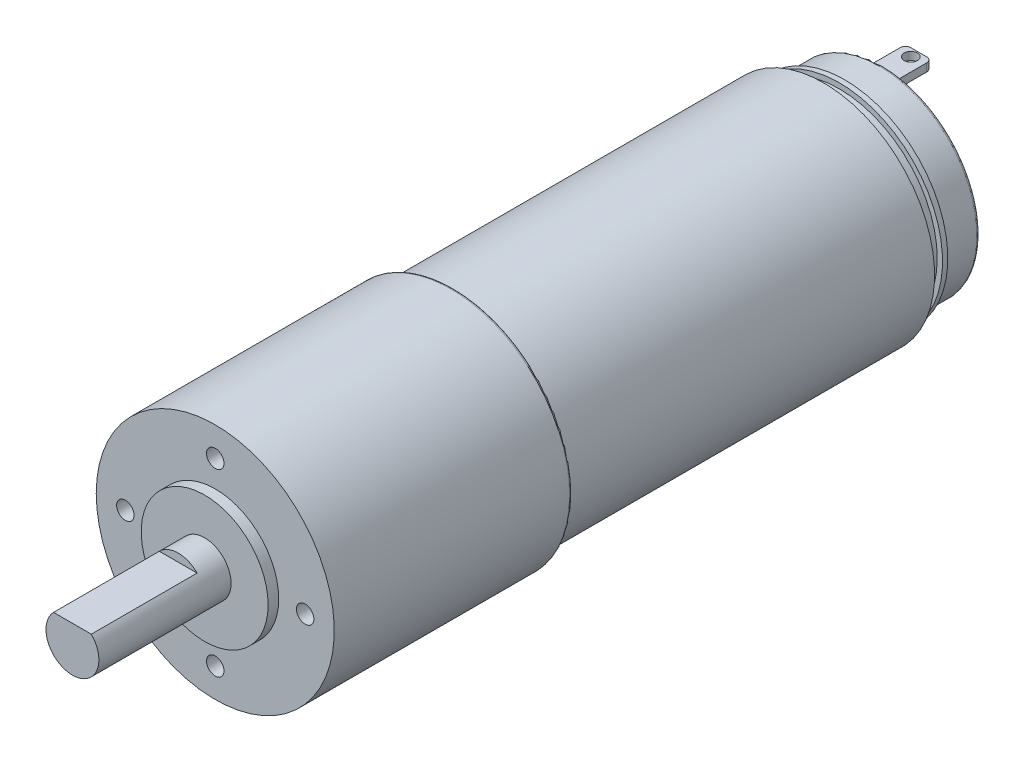
ISO-10303-21;
HEADER;
FILE_DESCRIPTION(('STEP AP214'),'2;1');
FILE_NAME('part.step','',(''),(''),'','','');
FILE_SCHEMA(('AUTOMOTIVE_DESIGN { 1 0 10303 214 1 1 1 1 }'));
ENDSEC;
DATA;
#1=APPLICATION_CONTEXT('core data for automotive mechanical design processes');
#2=APPLICATION_PROTOCOL_DEFINITION('international standard','automotive_design',2000,#1);
#3=PRODUCT_CONTEXT('',#1,'mechanical');
#4=PRODUCT('Part','Part','',(#3));
#5=PRODUCT_RELATED_PRODUCT_CATEGORY('part','',(#4));
#6=PRODUCT_DEFINITION_FORMATION('','',#4);
#7=PRODUCT_DEFINITION_CONTEXT('part definition',#1,'design');
#8=PRODUCT_DEFINITION('design','',#6,#7);
#9=PRODUCT_DEFINITION_SHAPE('','',#8);
#10=(LENGTH_UNIT() NAMED_UNIT(*) SI_UNIT(.MILLI.,.METRE.));
#11=(NAMED_UNIT(*) PLANE_ANGLE_UNIT() SI_UNIT($,.RADIAN.));
#12=(NAMED_UNIT(*) SI_UNIT($,.STERADIAN.) SOLID_ANGLE_UNIT());
#13=UNCERTAINTY_MEASURE_WITH_UNIT(LENGTH_MEASURE(1.E-05),#10,'distance_accuracy_value','');
#14=(GEOMETRIC_REPRESENTATION_CONTEXT(3) GLOBAL_UNCERTAINTY_ASSIGNED_CONTEXT((#13)) GLOBAL_UNIT_ASSIGNED_CONTEXT((#10,
#11,#12)) REPRESENTATION_CONTEXT('',''));
#15=CARTESIAN_POINT('',(0.,0.,0.));
#16=DIRECTION('',(0.,0.,1.));
#17=DIRECTION('',(1.,0.,0.));
#18=AXIS2_PLACEMENT_3D('',#15,#16,#17);
#19=CARTESIAN_POINT('',(0.,0.,-81.));
#20=DIRECTION('',(0.,0.,-1.));
#21=DIRECTION('',(-1.,0.,0.));
#22=AXIS2_PLACEMENT_3D('',#19,#20,#21);
#23=PLANE('',#22);
#24=CARTESIAN_POINT('',(0.,0.,-81.));
#25=DIRECTION('',(0.,0.,-1.));
#26=DIRECTION('',(-1.,0.,0.));
#27=AXIS2_PLACEMENT_3D('',#24,#25,#26);
#28=CIRCLE('',#27,18.);
#29=CARTESIAN_POINT('',(-18.,0.,-81.));
#30=VERTEX_POINT('',#29);
#31=EDGE_CURVE('E328',#30,#30,#28,.T.);
#32=ORIENTED_EDGE('',*,*,#31,.T.);
#33=EDGE_LOOP('',(#32));
#34=FACE_BOUND('',#33,.T.);
#35=DIRECTION('',(-1.,0.,0.));
#36=VECTOR('',#35,1.);
#37=CARTESIAN_POINT('',(2.5,15.5,-81.));
#38=LINE('',#37,#36);
#39=CARTESIAN_POINT('',(2.5,15.5,-81.));
#40=VERTEX_POINT('',#39);
#41=CARTESIAN_POINT('',(-2.5,15.5,-81.));
#42=VERTEX_POINT('',#41);
#43=EDGE_CURVE('E203',#40,#42,#38,.T.);
#44=ORIENTED_EDGE('',*,*,#43,.F.);
#45=DIRECTION('',(0.,-1.,0.));
#46=VECTOR('',#45,1.);
#47=CARTESIAN_POINT('',(2.5,17.,-81.));
#48=LINE('',#47,#46);
#49=CARTESIAN_POINT('',(2.5,17.,-81.));
#50=VERTEX_POINT('',#49);
#51=EDGE_CURVE('E166',#50,#40,#48,.T.);
#52=ORIENTED_EDGE('',*,*,#51,.F.);
#53=DIRECTION('',(1.,0.,0.));
#54=VECTOR('',#53,1.);
#55=CARTESIAN_POINT('',(2.5,17.,-81.));
#56=LINE('',#55,#54);
#57=CARTESIAN_POINT('',(-2.5,17.,-81.));
#58=VERTEX_POINT('',#57);
#59=EDGE_CURVE('E197',#58,#50,#56,.T.);
#60=ORIENTED_EDGE('',*,*,#59,.F.);
#61=DIRECTION('',(0.,1.,0.));
#62=VECTOR('',#61,1.);
#63=CARTESIAN_POINT('',(-2.5,17.,-81.));
#64=LINE('',#63,#62);
#65=EDGE_CURVE('E206',#42,#58,#64,.T.);
#66=ORIENTED_EDGE('',*,*,#65,.F.);
#67=EDGE_LOOP('',(#44,#52,#60,#66));
#68=FACE_BOUND('',#67,.T.);
#69=DIRECTION('',(0.,1.,0.));
#70=VECTOR('',#69,1.);
#71=CARTESIAN_POINT('',(-2.49999999999999,-16.9999999999999,-81.));
#72=LINE('',#71,#70);
#73=CARTESIAN_POINT('',(-2.49999999999999,-16.9999999999999,-81.));
#74=VERTEX_POINT('',#73);
#75=CARTESIAN_POINT('',(-2.5,-15.5,-81.));
#76=VERTEX_POINT('',#75);
#77=EDGE_CURVE('E160',#74,#76,#72,.T.);
#78=ORIENTED_EDGE('',*,*,#77,.F.);
#79=DIRECTION('',(-1.,0.,0.));
#80=VECTOR('',#79,1.);
#81=CARTESIAN_POINT('',(-2.49999999999999,-16.9999999999999,-81.));
#82=LINE('',#81,#80);
#83=CARTESIAN_POINT('',(2.50000000000001,-16.9999999999999,-81.));
#84=VERTEX_POINT('',#83);
#85=EDGE_CURVE('E170',#84,#74,#82,.T.);
#86=ORIENTED_EDGE('',*,*,#85,.F.);
#87=DIRECTION('',(0.,-1.,0.));
#88=VECTOR('',#87,1.);
#89=CARTESIAN_POINT('',(2.50000000000001,-16.9999999999999,-81.));
#90=LINE('',#89,#88);
#91=CARTESIAN_POINT('',(2.50000000000001,-15.5,-81.));
#92=VERTEX_POINT('',#91);
#93=EDGE_CURVE('E182',#92,#84,#90,.T.);
#94=ORIENTED_EDGE('',*,*,#93,.F.);
#95=DIRECTION('',(1.,0.,0.));
#96=VECTOR('',#95,1.);
#97=CARTESIAN_POINT('',(-2.5,-15.5,-81.));
#98=LINE('',#97,#96);
#99=EDGE_CURVE('E180',#76,#92,#98,.T.);
#100=ORIENTED_EDGE('',*,*,#99,.F.);
#101=EDGE_LOOP('',(#78,#86,#94,#100));
#102=FACE_BOUND('',#101,.T.);
#103=ADVANCED_FACE('F42',(#34,#68,#102),#23,.T.);
#104=CARTESIAN_POINT('',(0.,0.,45.));
#105=DIRECTION('',(0.,0.,-1.));
#106=DIRECTION('',(-1.,0.,0.));
#107=AXIS2_PLACEMENT_3D('',#104,#105,#106);
#108=CYLINDRICAL_SURFACE('',#107,22.5);
#109=CARTESIAN_POINT('',(0.,0.,0.5));
#110=DIRECTION('',(0.,0.,1.));
#111=DIRECTION('',(1.,0.,0.));
#112=AXIS2_PLACEMENT_3D('',#109,#110,#111);
#113=CIRCLE('',#112,22.5);
#114=CARTESIAN_POINT('',(-22.5,0.,0.499999999999994));
#115=VERTEX_POINT('',#114);
#116=EDGE_CURVE('E50',#115,#115,#113,.T.);
#117=CARTESIAN_POINT('',(0.,0.,45.));
#118=DIRECTION('',(0.,0.,1.));
#119=DIRECTION('',(1.,0.,0.));
#120=AXIS2_PLACEMENT_3D('',#117,#118,#119);
#121=CIRCLE('',#120,22.5);
#122=CARTESIAN_POINT('',(-22.5,0.,45.));
#123=VERTEX_POINT('',#122);
#124=EDGE_CURVE('E259',#123,#123,#121,.T.);
#125=CARTESIAN_POINT('',(-22.5,0.,0.499999999999994));
#126=CARTESIAN_POINT('',(-22.5,0.,0.963541666666661));
#127=CARTESIAN_POINT('',(-22.5,0.,1.42708333333333));
#128=CARTESIAN_POINT('',(-22.5,0.,2.35416666666666));
#129=CARTESIAN_POINT('',(-22.5,0.,2.81770833333333));
#130=CARTESIAN_POINT('',(-22.5,0.,3.74479166666666));
#131=CARTESIAN_POINT('',(-22.5,0.,4.20833333333333));
#132=CARTESIAN_POINT('',(-22.5,0.,5.13541666666666));
#133=CARTESIAN_POINT('',(-22.5,0.,5.59895833333333));
#134=CARTESIAN_POINT('',(-22.5,0.,6.52604166666666));
#135=CARTESIAN_POINT('',(-22.5,0.,6.98958333333333));
#136=CARTESIAN_POINT('',(-22.5,0.,7.91666666666666));
#137=CARTESIAN_POINT('',(-22.5,0.,8.38020833333333));
#138=CARTESIAN_POINT('',(-22.5,0.,9.30729166666666));
#139=CARTESIAN_POINT('',(-22.5,0.,9.77083333333333));
#140=CARTESIAN_POINT('',(-22.5,0.,10.6979166666667));
#141=CARTESIAN_POINT('',(-22.5,0.,11.1614583333333));
#142=CARTESIAN_POINT('',(-22.5,0.,12.0885416666667));
#143=CARTESIAN_POINT('',(-22.5,0.,12.5520833333333));
#144=CARTESIAN_POINT('',(-22.5,0.,13.4791666666667));
#145=CARTESIAN_POINT('',(-22.5,0.,13.9427083333333));
#146=CARTESIAN_POINT('',(-22.5,0.,14.8697916666667));
#147=CARTESIAN_POINT('',(-22.5,0.,15.3333333333333));
#148=CARTESIAN_POINT('',(-22.5,0.,16.2604166666667));
#149=CARTESIAN_POINT('',(-22.5,0.,16.7239583333333));
#150=CARTESIAN_POINT('',(-22.5,0.,17.6510416666667));
#151=CARTESIAN_POINT('',(-22.5,0.,18.1145833333333));
#152=CARTESIAN_POINT('',(-22.5,0.,19.0416666666667));
#153=CARTESIAN_POINT('',(-22.5,0.,19.5052083333333));
#154=CARTESIAN_POINT('',(-22.5,0.,20.4322916666667));
#155=CARTESIAN_POINT('',(-22.5,0.,20.8958333333333));
#156=CARTESIAN_POINT('',(-22.5,0.,21.8229166666667));
#157=CARTESIAN_POINT('',(-22.5,0.,22.2864583333333));
#158=CARTESIAN_POINT('',(-22.5,0.,23.2135416666667));
#159=CARTESIAN_POINT('',(-22.5,0.,23.6770833333333));
#160=CARTESIAN_POINT('',(-22.5,0.,24.6041666666667));
#161=CARTESIAN_POINT('',(-22.5,0.,25.0677083333333));
#162=CARTESIAN_POINT('',(-22.5,0.,25.9947916666667));
#163=CARTESIAN_POINT('',(-22.5,0.,26.4583333333333));
#164=CARTESIAN_POINT('',(-22.5,0.,27.3854166666667));
#165=CARTESIAN_POINT('',(-22.5,0.,27.8489583333333));
#166=CARTESIAN_POINT('',(-22.5,0.,28.7760416666667));
#167=CARTESIAN_POINT('',(-22.5,0.,29.2395833333333));
#168=CARTESIAN_POINT('',(-22.5,0.,30.1666666666667));
#169=CARTESIAN_POINT('',(-22.5,0.,30.6302083333333));
#170=CARTESIAN_POINT('',(-22.5,0.,31.5572916666667));
#171=CARTESIAN_POINT('',(-22.5,0.,32.0208333333333));
#172=CARTESIAN_POINT('',(-22.5,0.,32.9479166666667));
#173=CARTESIAN_POINT('',(-22.5,0.,33.4114583333333));
#174=CARTESIAN_POINT('',(-22.5,0.,34.3385416666667));
#175=CARTESIAN_POINT('',(-22.5,0.,34.8020833333333));
#176=CARTESIAN_POINT('',(-22.5,0.,35.7291666666667));
#177=CARTESIAN_POINT('',(-22.5,0.,36.1927083333333));
#178=CARTESIAN_POINT('',(-22.5,0.,37.1197916666667));
#179=CARTESIAN_POINT('',(-22.5,0.,37.5833333333333));
#180=CARTESIAN_POINT('',(-22.5,0.,38.5104166666667));
#181=CARTESIAN_POINT('',(-22.5,0.,38.9739583333333));
#182=CARTESIAN_POINT('',(-22.5,0.,39.9010416666667));
#183=CARTESIAN_POINT('',(-22.5,0.,40.3645833333333));
#184=CARTESIAN_POINT('',(-22.5,0.,41.2916666666667));
#185=CARTESIAN_POINT('',(-22.5,0.,41.7552083333333));
#186=CARTESIAN_POINT('',(-22.5,0.,42.6822916666667));
#187=CARTESIAN_POINT('',(-22.5,0.,43.1458333333333));
#188=CARTESIAN_POINT('',(-22.5,0.,44.0729166666667));
#189=CARTESIAN_POINT('',(-22.5,0.,44.5364583333333));
#190=CARTESIAN_POINT('',(-22.5,0.,45.));
#191=B_SPLINE_CURVE_WITH_KNOTS('',3,(#125,#126,#127,#128,#129,#130,#131,#132,#133,#134,#135,
#136,#137,#138,#139,#140,#141,#142,#143,#144,#145,#146,#147,#148,#149,#150,#151,#152,#153,#154,
#155,#156,#157,#158,#159,#160,#161,#162,#163,#164,#165,#166,#167,#168,#169,#170,#171,#172,#173,
#174,#175,#176,#177,#178,#179,#180,#181,#182,#183,#184,#185,#186,#187,#188,#189,#190),
.UNSPECIFIED.,.F.,.F.,(4,2,2,2,2,2,2,2,2,2,2,2,2,2,2,2,2,2,2,2,2,2,2,2,2,2,2,2,2,2,2,2,4),(0.,
1.390625,2.78125,4.171875,5.5625,6.953125,8.34375,9.734375,11.125,12.515625,13.90625,15.296875,
16.6875,18.078125,19.46875,20.859375,22.25,23.640625,25.03125,26.421875,27.8125,29.203125,
30.59375,31.984375,33.375,34.765625,36.15625,37.546875,38.9375,40.328125,41.71875,43.109375,
44.5),.UNSPECIFIED.);
#192=EDGE_CURVE('BSEAM336',#115,#123,#191,.T.);
#193=ORIENTED_EDGE('',*,*,#116,.T.);
#194=ORIENTED_EDGE('',*,*,#124,.F.);
#195=ORIENTED_EDGE('',*,*,#192,.T.);
#196=ORIENTED_EDGE('',*,*,#192,.F.);
#197=EDGE_LOOP('',(#193,#195,#194,#196));
#198=FACE_BOUND('',#197,.T.);
#199=ADVANCED_FACE('F336',(#198),#108,.T.);
#200=CARTESIAN_POINT('',(0.,0.,45.));
#201=DIRECTION('',(0.,0.,1.));
#202=DIRECTION('',(1.,0.,0.));
#203=AXIS2_PLACEMENT_3D('',#200,#201,#202);
#204=PLANE('',#203);
#205=CARTESIAN_POINT('',(0.,0.,45.));
#206=DIRECTION('',(0.,0.,1.));
#207=DIRECTION('',(1.,0.,0.));
#208=AXIS2_PLACEMENT_3D('',#205,#206,#207);
#209=CIRCLE('',#208,12.);
#210=CARTESIAN_POINT('',(12.,0.,45.));
#211=VERTEX_POINT('',#210);
#212=EDGE_CURVE('E256',#211,#211,#209,.T.);
#213=ORIENTED_EDGE('',*,*,#212,.F.);
#214=EDGE_LOOP('',(#213));
#215=FACE_BOUND('',#214,.T.);
#216=CARTESIAN_POINT('',(0.,17.,45.));
#217=DIRECTION('',(0.,0.,1.));
#218=DIRECTION('',(1.,0.,0.));
#219=AXIS2_PLACEMENT_3D('',#216,#217,#218);
#220=CIRCLE('',#219,1.64999999999999);
#221=CARTESIAN_POINT('',(1.64999999999999,17.,45.));
#222=VERTEX_POINT('',#221);
#223=EDGE_CURVE('E263',#222,#222,#220,.T.);
#224=ORIENTED_EDGE('',*,*,#223,.F.);
#225=EDGE_LOOP('',(#224));
#226=FACE_BOUND('',#225,.T.);
#227=CARTESIAN_POINT('',(17.,0.,45.));
#228=DIRECTION('',(0.,0.,1.));
#229=DIRECTION('',(1.,0.,0.));
#230=AXIS2_PLACEMENT_3D('',#227,#228,#229);
#231=CIRCLE('',#230,1.64999999999999);
#232=CARTESIAN_POINT('',(18.65,0.,45.));
#233=VERTEX_POINT('',#232);
#234=EDGE_CURVE('E271',#233,#233,#231,.T.);
#235=ORIENTED_EDGE('',*,*,#234,.F.);
#236=EDGE_LOOP('',(#235));
#237=FACE_BOUND('',#236,.T.);
#238=CARTESIAN_POINT('',(0.,-17.,45.));
#239=DIRECTION('',(0.,0.,1.));
#240=DIRECTION('',(1.,0.,0.));
#241=AXIS2_PLACEMENT_3D('',#238,#239,#240);
#242=CIRCLE('',#241,1.64999999999999);
#243=CARTESIAN_POINT('',(1.64999999999999,-17.,45.));
#244=VERTEX_POINT('',#243);
#245=EDGE_CURVE('E277',#244,#244,#242,.T.);
#246=ORIENTED_EDGE('',*,*,#245,.F.);
#247=EDGE_LOOP('',(#246));
#248=FACE_BOUND('',#247,.T.);
#249=CARTESIAN_POINT('',(-17.,0.,45.));
#250=DIRECTION('',(0.,0.,1.));
#251=DIRECTION('',(1.,0.,0.));
#252=AXIS2_PLACEMENT_3D('',#249,#250,#251);
#253=CIRCLE('',#252,1.64999999999999);
#254=CARTESIAN_POINT('',(-15.35,0.,45.));
#255=VERTEX_POINT('',#254);
#256=EDGE_CURVE('E283',#255,#255,#253,.T.);
#257=ORIENTED_EDGE('',*,*,#256,.F.);
#258=EDGE_LOOP('',(#257));
#259=FACE_BOUND('',#258,.T.);
#260=ORIENTED_EDGE('',*,*,#124,.T.);
#261=EDGE_LOOP('',(#260));
#262=FACE_BOUND('',#261,.T.);
#263=ADVANCED_FACE('F354',(#215,#226,#237,#248,#259,#262),#204,.T.);
#264=CARTESIAN_POINT('',(0.,0.,0.));
#265=DIRECTION('',(0.,0.,1.));
#266=DIRECTION('',(1.,0.,0.));
#267=AXIS2_PLACEMENT_3D('',#264,#265,#266);
#268=PLANE('',#267);
#269=CARTESIAN_POINT('',(0.,0.,0.));
#270=DIRECTION('',(0.,0.,1.));
#271=DIRECTION('',(1.,0.,0.));
#272=AXIS2_PLACEMENT_3D('',#269,#270,#271);
#273=CIRCLE('',#272,22.);
#274=CARTESIAN_POINT('',(22.,0.,0.));
#275=VERTEX_POINT('',#274);
#276=EDGE_CURVE('E11',#275,#275,#273,.F.);
#277=ORIENTED_EDGE('',*,*,#276,.T.);
#278=EDGE_LOOP('',(#277));
#279=FACE_BOUND('',#278,.T.);
#280=CARTESIAN_POINT('',(0.,0.,0.));
#281=DIRECTION('',(0.,0.,-1.));
#282=DIRECTION('',(-1.,0.,0.));
#283=AXIS2_PLACEMENT_3D('',#280,#281,#282);
#284=CIRCLE('',#283,21.);
#285=CARTESIAN_POINT('',(-21.,0.,0.));
#286=VERTEX_POINT('',#285);
#287=EDGE_CURVE('E235',#286,#286,#284,.T.);
#288=ORIENTED_EDGE('',*,*,#287,.F.);
#289=EDGE_LOOP('',(#288));
#290=FACE_BOUND('',#289,.T.);
#291=ADVANCED_FACE('F444',(#279,#290),#268,.F.);
#292=CARTESIAN_POINT('',(-17.,0.,34.9));
#293=DIRECTION('',(0.,0.,1.));
#294=DIRECTION('',(1.,0.,0.));
#295=AXIS2_PLACEMENT_3D('',#292,#293,#294);
#296=CONICAL_SURFACE('',#295,1.64999999999999,1.02974425867665);
#297=CARTESIAN_POINT('',(-17.,0.,33.9085799786045));
#298=VERTEX_POINT('',#297);
#299=VERTEX_LOOP('',#298);
#300=FACE_BOUND('',#299,.T.);
#301=CARTESIAN_POINT('',(-17.,0.,34.9));
#302=DIRECTION('',(0.,0.,1.));
#303=DIRECTION('',(1.,0.,0.));
#304=AXIS2_PLACEMENT_3D('',#301,#302,#303);
#305=CIRCLE('',#304,1.64999999999999);
#306=CARTESIAN_POINT('',(-15.35,0.,34.9));
#307=VERTEX_POINT('',#306);
#308=EDGE_CURVE('E286',#307,#307,#305,.T.);
#309=ORIENTED_EDGE('',*,*,#308,.T.);
#310=EDGE_LOOP('',(#309));
#311=FACE_BOUND('',#310,.T.);
#312=ADVANCED_FACE('F440',(#300,#311),#296,.F.);
#313=CARTESIAN_POINT('',(-17.,0.,45.));
#314=DIRECTION('',(0.,0.,1.));
#315=DIRECTION('',(1.,0.,0.));
#316=AXIS2_PLACEMENT_3D('',#313,#314,#315);
#317=CYLINDRICAL_SURFACE('',#316,1.64999999999999);
#318=ORIENTED_EDGE('',*,*,#308,.F.);
#319=EDGE_LOOP('',(#318));
#320=FACE_BOUND('',#319,.T.);
#321=ORIENTED_EDGE('',*,*,#256,.T.);
#322=EDGE_LOOP('',(#321));
#323=FACE_BOUND('',#322,.T.);
#324=ADVANCED_FACE('F436',(#320,#323),#317,.F.);
#325=CARTESIAN_POINT('',(0.,-17.,34.9));
#326=DIRECTION('',(0.,0.,1.));
#327=DIRECTION('',(1.,0.,0.));
#328=AXIS2_PLACEMENT_3D('',#325,#326,#327);
#329=CONICAL_SURFACE('',#328,1.64999999999999,1.02974425867665);
#330=CARTESIAN_POINT('',(0.,-17.,33.9085799786045));
#331=VERTEX_POINT('',#330);
#332=VERTEX_LOOP('',#331);
#333=FACE_BOUND('',#332,.T.);
#334=CARTESIAN_POINT('',(0.,-17.,34.9));
#335=DIRECTION('',(0.,0.,1.));
#336=DIRECTION('',(1.,0.,0.));
#337=AXIS2_PLACEMENT_3D('',#334,#335,#336);
#338=CIRCLE('',#337,1.64999999999999);
#339=CARTESIAN_POINT('',(1.64999999999999,-17.,34.9));
#340=VERTEX_POINT('',#339);
#341=EDGE_CURVE('E280',#340,#340,#338,.T.);
#342=ORIENTED_EDGE('',*,*,#341,.T.);
#343=EDGE_LOOP('',(#342));
#344=FACE_BOUND('',#343,.T.);
#345=ADVANCED_FACE('F432',(#333,#344),#329,.F.);
#346=CARTESIAN_POINT('',(0.,-17.,45.));
#347=DIRECTION('',(0.,0.,1.));
#348=DIRECTION('',(1.,0.,0.));
#349=AXIS2_PLACEMENT_3D('',#346,#347,#348);
#350=CYLINDRICAL_SURFACE('',#349,1.64999999999999);
#351=ORIENTED_EDGE('',*,*,#341,.F.);
#352=EDGE_LOOP('',(#351));
#353=FACE_BOUND('',#352,.T.);
#354=ORIENTED_EDGE('',*,*,#245,.T.);
#355=EDGE_LOOP('',(#354));
#356=FACE_BOUND('',#355,.T.);
#357=ADVANCED_FACE('F428',(#353,#356),#350,.F.);
#358=CARTESIAN_POINT('',(17.,0.,34.9));
#359=DIRECTION('',(0.,0.,1.));
#360=DIRECTION('',(1.,0.,0.));
#361=AXIS2_PLACEMENT_3D('',#358,#359,#360);
#362=CONICAL_SURFACE('',#361,1.64999999999999,1.02974425867665);
#363=CARTESIAN_POINT('',(17.,0.,33.9085799786045));
#364=VERTEX_POINT('',#363);
#365=VERTEX_LOOP('',#364);
#366=FACE_BOUND('',#365,.T.);
#367=CARTESIAN_POINT('',(17.,0.,34.9));
#368=DIRECTION('',(0.,0.,1.));
#369=DIRECTION('',(1.,0.,0.));
#370=AXIS2_PLACEMENT_3D('',#367,#368,#369);
#371=CIRCLE('',#370,1.64999999999999);
#372=CARTESIAN_POINT('',(18.65,0.,34.9));
#373=VERTEX_POINT('',#372);
#374=EDGE_CURVE('E274',#373,#373,#371,.T.);
#375=ORIENTED_EDGE('',*,*,#374,.T.);
#376=EDGE_LOOP('',(#375));
#377=FACE_BOUND('',#376,.T.);
#378=ADVANCED_FACE('F424',(#366,#377),#362,.F.);
#379=CARTESIAN_POINT('',(17.,0.,45.));
#380=DIRECTION('',(0.,0.,1.));
#381=DIRECTION('',(1.,0.,0.));
#382=AXIS2_PLACEMENT_3D('',#379,#380,#381);
#383=CYLINDRICAL_SURFACE('',#382,1.64999999999999);
#384=ORIENTED_EDGE('',*,*,#374,.F.);
#385=EDGE_LOOP('',(#384));
#386=FACE_BOUND('',#385,.T.);
#387=ORIENTED_EDGE('',*,*,#234,.T.);
#388=EDGE_LOOP('',(#387));
#389=FACE_BOUND('',#388,.T.);
#390=ADVANCED_FACE('F420',(#386,#389),#383,.F.);
#391=CARTESIAN_POINT('',(0.,17.,34.9));
#392=DIRECTION('',(0.,0.,1.));
#393=DIRECTION('',(1.,0.,0.));
#394=AXIS2_PLACEMENT_3D('',#391,#392,#393);
#395=CONICAL_SURFACE('',#394,1.64999999999999,1.02974425867665);
#396=CARTESIAN_POINT('',(0.,17.,33.9085799786045));
#397=VERTEX_POINT('',#396);
#398=VERTEX_LOOP('',#397);
#399=FACE_BOUND('',#398,.T.);
#400=CARTESIAN_POINT('',(0.,17.,34.9));
#401=DIRECTION('',(0.,0.,1.));
#402=DIRECTION('',(1.,0.,0.));
#403=AXIS2_PLACEMENT_3D('',#400,#401,#402);
#404=CIRCLE('',#403,1.64999999999999);
#405=CARTESIAN_POINT('',(1.64999999999999,17.,34.9));
#406=VERTEX_POINT('',#405);
#407=EDGE_CURVE('E268',#406,#406,#404,.T.);
#408=ORIENTED_EDGE('',*,*,#407,.T.);
#409=EDGE_LOOP('',(#408));
#410=FACE_BOUND('',#409,.T.);
#411=ADVANCED_FACE('F416',(#399,#410),#395,.F.);
#412=CARTESIAN_POINT('',(0.,17.,45.));
#413=DIRECTION('',(0.,0.,1.));
#414=DIRECTION('',(1.,0.,0.));
#415=AXIS2_PLACEMENT_3D('',#412,#413,#414);
#416=CYLINDRICAL_SURFACE('',#415,1.64999999999999);
#417=ORIENTED_EDGE('',*,*,#407,.F.);
#418=EDGE_LOOP('',(#417));
#419=FACE_BOUND('',#418,.T.);
#420=ORIENTED_EDGE('',*,*,#223,.T.);
#421=EDGE_LOOP('',(#420));
#422=FACE_BOUND('',#421,.T.);
#423=ADVANCED_FACE('F412',(#419,#422),#416,.F.);
#424=CARTESIAN_POINT('',(0.,0.,47.));
#425=DIRECTION('',(0.,0.,-1.));
#426=DIRECTION('',(-1.,0.,0.));
#427=AXIS2_PLACEMENT_3D('',#424,#425,#426);
#428=CYLINDRICAL_SURFACE('',#427,12.);
#429=CARTESIAN_POINT('',(0.,0.,47.));
#430=DIRECTION('',(0.,0.,1.));
#431=DIRECTION('',(1.,0.,0.));
#432=AXIS2_PLACEMENT_3D('',#429,#430,#431);
#433=CIRCLE('',#432,12.);
#434=CARTESIAN_POINT('',(12.,0.,47.));
#435=VERTEX_POINT('',#434);
#436=EDGE_CURVE('E260',#435,#435,#433,.T.);
#437=ORIENTED_EDGE('',*,*,#436,.F.);
#438=EDGE_LOOP('',(#437));
#439=FACE_BOUND('',#438,.T.);
#440=ORIENTED_EDGE('',*,*,#212,.T.);
#441=EDGE_LOOP('',(#440));
#442=FACE_BOUND('',#441,.T.);
#443=ADVANCED_FACE('F408',(#439,#442),#428,.T.);
#444=CARTESIAN_POINT('',(0.,0.,47.));
#445=DIRECTION('',(0.,0.,1.));
#446=DIRECTION('',(1.,0.,0.));
#447=AXIS2_PLACEMENT_3D('',#444,#445,#446);
#448=PLANE('',#447);
#449=CARTESIAN_POINT('',(0.,0.,47.));
#450=DIRECTION('',(0.,0.,1.));
#451=DIRECTION('',(1.,0.,0.));
#452=AXIS2_PLACEMENT_3D('',#449,#450,#451);
#453=CIRCLE('',#452,5.);
#454=CARTESIAN_POINT('',(5.,0.,47.));
#455=VERTEX_POINT('',#454);
#456=EDGE_CURVE('E241',#455,#455,#453,.T.);
#457=ORIENTED_EDGE('',*,*,#456,.F.);
#458=EDGE_LOOP('',(#457));
#459=FACE_BOUND('',#458,.T.);
#460=ORIENTED_EDGE('',*,*,#436,.T.);
#461=EDGE_LOOP('',(#460));
#462=FACE_BOUND('',#461,.T.);
#463=ADVANCED_FACE('F404',(#459,#462),#448,.T.);
#464=CARTESIAN_POINT('',(0.,0.,72.));
#465=DIRECTION('',(0.,0.,-1.));
#466=DIRECTION('',(-1.,0.,0.));
#467=AXIS2_PLACEMENT_3D('',#464,#465,#466);
#468=CYLINDRICAL_SURFACE('',#467,5.);
#469=CARTESIAN_POINT('',(0.,0.,72.));
#470=DIRECTION('',(0.,0.,1.));
#471=DIRECTION('',(1.,0.,0.));
#472=AXIS2_PLACEMENT_3D('',#469,#470,#471);
#473=CIRCLE('',#472,5.);
#474=CARTESIAN_POINT('',(-3.57071421427142,3.5,72.));
#475=VERTEX_POINT('',#474);
#476=CARTESIAN_POINT('',(3.57071421427143,3.5,72.));
#477=VERTEX_POINT('',#476);
#478=EDGE_CURVE('E252',#475,#477,#473,.T.);
#479=ORIENTED_EDGE('',*,*,#478,.F.);
#480=DIRECTION('',(0.,0.,1.));
#481=VECTOR('',#480,1.);
#482=CARTESIAN_POINT('',(-3.57071421427143,3.5,52.));
#483=LINE('',#482,#481);
#484=CARTESIAN_POINT('',(-3.57071421427143,3.5,52.));
#485=VERTEX_POINT('',#484);
#486=EDGE_CURVE('E247',#485,#475,#483,.T.);
#487=ORIENTED_EDGE('',*,*,#486,.F.);
#488=CARTESIAN_POINT('',(0.,0.,52.));
#489=DIRECTION('',(0.,0.,1.));
#490=DIRECTION('',(1.,0.,0.));
#491=AXIS2_PLACEMENT_3D('',#488,#489,#490);
#492=CIRCLE('',#491,5.);
#493=CARTESIAN_POINT('',(3.57071421427143,3.5,52.));
#494=VERTEX_POINT('',#493);
#495=EDGE_CURVE('E242',#494,#485,#492,.T.);
#496=ORIENTED_EDGE('',*,*,#495,.F.);
#497=DIRECTION('',(0.,0.,1.));
#498=VECTOR('',#497,1.);
#499=CARTESIAN_POINT('',(3.57071421427143,3.5,52.));
#500=LINE('',#499,#498);
#501=EDGE_CURVE('E249',#494,#477,#500,.T.);
#502=ORIENTED_EDGE('',*,*,#501,.T.);
#503=EDGE_LOOP('',(#479,#487,#496,#502));
#504=FACE_BOUND('',#503,.T.);
#505=ORIENTED_EDGE('',*,*,#456,.T.);
#506=EDGE_LOOP('',(#505));
#507=FACE_BOUND('',#506,.T.);
#508=ADVANCED_FACE('F400',(#504,#507),#468,.T.);
#509=CARTESIAN_POINT('',(0.,0.,72.));
#510=DIRECTION('',(0.,0.,1.));
#511=DIRECTION('',(1.,0.,0.));
#512=AXIS2_PLACEMENT_3D('',#509,#510,#511);
#513=PLANE('',#512);
#514=DIRECTION('',(1.,0.,0.));
#515=VECTOR('',#514,1.);
#516=CARTESIAN_POINT('',(-3.57071421427143,3.5,72.));
#517=LINE('',#516,#515);
#518=EDGE_CURVE('E238',#475,#477,#517,.T.);
#519=ORIENTED_EDGE('',*,*,#518,.F.);
#520=ORIENTED_EDGE('',*,*,#478,.T.);
#521=EDGE_LOOP('',(#519,#520));
#522=FACE_BOUND('',#521,.T.);
#523=ADVANCED_FACE('F396',(#522),#513,.T.);
#524=CARTESIAN_POINT('',(-3.57071421427143,3.5,52.));
#525=DIRECTION('',(0.,-1.,0.));
#526=DIRECTION('',(0.,0.,-1.));
#527=AXIS2_PLACEMENT_3D('',#524,#525,#526);
#528=PLANE('',#527);
#529=ORIENTED_EDGE('',*,*,#518,.T.);
#530=ORIENTED_EDGE('',*,*,#501,.F.);
#531=DIRECTION('',(1.,0.,0.));
#532=VECTOR('',#531,1.);
#533=CARTESIAN_POINT('',(-3.57071421427143,3.5,52.));
#534=LINE('',#533,#532);
#535=EDGE_CURVE('E244',#485,#494,#534,.T.);
#536=ORIENTED_EDGE('',*,*,#535,.F.);
#537=ORIENTED_EDGE('',*,*,#486,.T.);
#538=EDGE_LOOP('',(#529,#530,#536,#537));
#539=FACE_BOUND('',#538,.T.);
#540=ADVANCED_FACE('F392',(#539),#528,.F.);
#541=CARTESIAN_POINT('',(0.,0.,52.));
#542=DIRECTION('',(0.,0.,1.));
#543=DIRECTION('',(1.,0.,0.));
#544=AXIS2_PLACEMENT_3D('',#541,#542,#543);
#545=PLANE('',#544);
#546=ORIENTED_EDGE('',*,*,#495,.T.);
#547=ORIENTED_EDGE('',*,*,#535,.T.);
#548=EDGE_LOOP('',(#546,#547));
#549=FACE_BOUND('',#548,.T.);
#550=ADVANCED_FACE('F388',(#549),#545,.T.);
#551=CARTESIAN_POINT('',(0.,0.,-70.));
#552=DIRECTION('',(0.,0.,1.));
#553=DIRECTION('',(1.,0.,0.));
#554=AXIS2_PLACEMENT_3D('',#551,#552,#553);
#555=CYLINDRICAL_SURFACE('',#554,21.);
#556=CARTESIAN_POINT('',(0.,0.,-70.));
#557=DIRECTION('',(0.,0.,-1.));
#558=DIRECTION('',(-1.,0.,0.));
#559=AXIS2_PLACEMENT_3D('',#556,#557,#558);
#560=CIRCLE('',#559,21.);
#561=CARTESIAN_POINT('',(-21.,0.,-70.));
#562=VERTEX_POINT('',#561);
#563=EDGE_CURVE('E232',#562,#562,#560,.T.);
#564=ORIENTED_EDGE('',*,*,#563,.F.);
#565=EDGE_LOOP('',(#564));
#566=FACE_BOUND('',#565,.T.);
#567=ORIENTED_EDGE('',*,*,#287,.T.);
#568=EDGE_LOOP('',(#567));
#569=FACE_BOUND('',#568,.T.);
#570=ADVANCED_FACE('F384',(#566,#569),#555,.T.);
#571=CARTESIAN_POINT('',(0.,0.,-70.));
#572=DIRECTION('',(0.,0.,-1.));
#573=DIRECTION('',(-1.,0.,0.));
#574=AXIS2_PLACEMENT_3D('',#571,#572,#573);
#575=PLANE('',#574);
#576=CARTESIAN_POINT('',(0.,0.,-70.));
#577=DIRECTION('',(0.,0.,-1.));
#578=DIRECTION('',(-1.,0.,0.));
#579=AXIS2_PLACEMENT_3D('',#576,#577,#578);
#580=CIRCLE('',#579,18.5);
#581=CARTESIAN_POINT('',(-18.5,0.,-70.));
#582=VERTEX_POINT('',#581);
#583=EDGE_CURVE('E223',#582,#582,#580,.T.);
#584=ORIENTED_EDGE('',*,*,#583,.F.);
#585=EDGE_LOOP('',(#584));
#586=FACE_BOUND('',#585,.T.);
#587=ORIENTED_EDGE('',*,*,#563,.T.);
#588=EDGE_LOOP('',(#587));
#589=FACE_BOUND('',#588,.T.);
#590=ADVANCED_FACE('F380',(#586,#589),#575,.T.);
#591=CARTESIAN_POINT('',(0.,0.,-73.));
#592=DIRECTION('',(0.,0.,1.));
#593=DIRECTION('',(1.,0.,0.));
#594=AXIS2_PLACEMENT_3D('',#591,#592,#593);
#595=CYLINDRICAL_SURFACE('',#594,18.5);
#596=CARTESIAN_POINT('',(0.,0.,-73.));
#597=DIRECTION('',(0.,0.,-1.));
#598=DIRECTION('',(-1.,0.,0.));
#599=AXIS2_PLACEMENT_3D('',#596,#597,#598);
#600=CIRCLE('',#599,18.5);
#601=CARTESIAN_POINT('',(-18.5,0.,-73.));
#602=VERTEX_POINT('',#601);
#603=EDGE_CURVE('E227',#602,#602,#600,.T.);
#604=ORIENTED_EDGE('',*,*,#603,.F.);
#605=EDGE_LOOP('',(#604));
#606=FACE_BOUND('',#605,.T.);
#607=ORIENTED_EDGE('',*,*,#583,.T.);
#608=EDGE_LOOP('',(#607));
#609=FACE_BOUND('',#608,.T.);
#610=ADVANCED_FACE('F376',(#606,#609),#595,.T.);
#611=CARTESIAN_POINT('',(0.,0.,-74.));
#612=DIRECTION('',(0.,0.,1.));
#613=DIRECTION('',(1.,0.,0.));
#614=AXIS2_PLACEMENT_3D('',#611,#612,#613);
#615=CYLINDRICAL_SURFACE('',#614,19.5);
#616=CARTESIAN_POINT('',(0.,0.,-74.));
#617=DIRECTION('',(0.,0.,-1.));
#618=DIRECTION('',(-1.,0.,0.));
#619=AXIS2_PLACEMENT_3D('',#616,#617,#618);
#620=CIRCLE('',#619,19.5);
#621=CARTESIAN_POINT('',(-19.5,0.,-74.));
#622=VERTEX_POINT('',#621);
#623=EDGE_CURVE('E224',#622,#622,#620,.T.);
#624=ORIENTED_EDGE('',*,*,#623,.F.);
#625=EDGE_LOOP('',(#624));
#626=FACE_BOUND('',#625,.T.);
#627=CARTESIAN_POINT('',(0.,0.,-73.));
#628=DIRECTION('',(0.,0.,-1.));
#629=DIRECTION('',(-1.,0.,0.));
#630=AXIS2_PLACEMENT_3D('',#627,#628,#629);
#631=CIRCLE('',#630,19.5);
#632=CARTESIAN_POINT('',(-19.5,0.,-73.));
#633=VERTEX_POINT('',#632);
#634=EDGE_CURVE('E218',#633,#633,#631,.T.);
#635=ORIENTED_EDGE('',*,*,#634,.T.);
#636=EDGE_LOOP('',(#635));
#637=FACE_BOUND('',#636,.T.);
#638=ADVANCED_FACE('F369',(#626,#637),#615,.T.);
#639=CARTESIAN_POINT('',(0.,0.,-74.));
#640=DIRECTION('',(0.,0.,-1.));
#641=DIRECTION('',(-1.,0.,0.));
#642=AXIS2_PLACEMENT_3D('',#639,#640,#641);
#643=PLANE('',#642);
#644=CARTESIAN_POINT('',(0.,0.,-74.));
#645=DIRECTION('',(0.,0.,-1.));
#646=DIRECTION('',(-1.,0.,0.));
#647=AXIS2_PLACEMENT_3D('',#644,#645,#646);
#648=CIRCLE('',#647,18.5);
#649=CARTESIAN_POINT('',(-18.5,0.,-74.));
#650=VERTEX_POINT('',#649);
#651=EDGE_CURVE('E219',#650,#650,#648,.T.);
#652=ORIENTED_EDGE('',*,*,#651,.F.);
#653=EDGE_LOOP('',(#652));
#654=FACE_BOUND('',#653,.T.);
#655=ORIENTED_EDGE('',*,*,#623,.T.);
#656=EDGE_LOOP('',(#655));
#657=FACE_BOUND('',#656,.T.);
#658=ADVANCED_FACE('F366',(#654,#657),#643,.T.);
#659=CARTESIAN_POINT('',(0.,0.,-73.));
#660=DIRECTION('',(0.,0.,-1.));
#661=DIRECTION('',(-1.,0.,0.));
#662=AXIS2_PLACEMENT_3D('',#659,#660,#661);
#663=PLANE('',#662);
#664=ORIENTED_EDGE('',*,*,#603,.T.);
#665=EDGE_LOOP('',(#664));
#666=FACE_BOUND('',#665,.T.);
#667=ORIENTED_EDGE('',*,*,#634,.F.);
#668=EDGE_LOOP('',(#667));
#669=FACE_BOUND('',#668,.T.);
#670=ADVANCED_FACE('F364',(#666,#669),#663,.F.);
#671=CARTESIAN_POINT('',(0.,0.,-81.));
#672=DIRECTION('',(0.,0.,1.));
#673=DIRECTION('',(1.,0.,0.));
#674=AXIS2_PLACEMENT_3D('',#671,#672,#673);
#675=CYLINDRICAL_SURFACE('',#674,18.5);
#676=CARTESIAN_POINT('',(0.,0.,-80.5));
#677=DIRECTION('',(0.,0.,-1.));
#678=DIRECTION('',(-1.,0.,0.));
#679=AXIS2_PLACEMENT_3D('',#676,#677,#678);
#680=CIRCLE('',#679,18.5);
#681=CARTESIAN_POINT('',(-18.5,0.,-80.5));
#682=VERTEX_POINT('',#681);
#683=EDGE_CURVE('E331',#682,#682,#680,.F.);
#684=ORIENTED_EDGE('',*,*,#683,.T.);
#685=EDGE_LOOP('',(#684));
#686=FACE_BOUND('',#685,.T.);
#687=ORIENTED_EDGE('',*,*,#651,.T.);
#688=EDGE_LOOP('',(#687));
#689=FACE_BOUND('',#688,.T.);
#690=ADVANCED_FACE('F361',(#686,#689),#675,.T.);
#691=CARTESIAN_POINT('',(2.5,17.,-88.));
#692=DIRECTION('',(-1.,0.,0.));
#693=DIRECTION('',(0.,-1.,0.));
#694=AXIS2_PLACEMENT_3D('',#691,#692,#693);
#695=PLANE('',#694);
#696=DIRECTION('',(0.,0.,1.));
#697=VECTOR('',#696,1.);
#698=CARTESIAN_POINT('',(2.5,15.5,-88.));
#699=LINE('',#698,#697);
#700=CARTESIAN_POINT('',(2.5,15.5,-87.));
#701=VERTEX_POINT('',#700);
#702=EDGE_CURVE('E216',#701,#40,#699,.T.);
#703=ORIENTED_EDGE('',*,*,#702,.F.);
#704=DIRECTION('',(0.,-1.,0.));
#705=VECTOR('',#704,1.);
#706=CARTESIAN_POINT('',(2.5,17.,-87.));
#707=LINE('',#706,#705);
#708=CARTESIAN_POINT('',(2.5,17.,-87.));
#709=VERTEX_POINT('',#708);
#710=EDGE_CURVE('E305',#701,#709,#707,.F.);
#711=ORIENTED_EDGE('',*,*,#710,.T.);
#712=DIRECTION('',(0.,0.,1.));
#713=VECTOR('',#712,1.);
#714=CARTESIAN_POINT('',(2.5,17.,-88.));
#715=LINE('',#714,#713);
#716=EDGE_CURVE('E200',#709,#50,#715,.T.);
#717=ORIENTED_EDGE('',*,*,#716,.T.);
#718=ORIENTED_EDGE('',*,*,#51,.T.);
#719=EDGE_LOOP('',(#703,#711,#717,#718));
#720=FACE_BOUND('',#719,.T.);
#721=ADVANCED_FACE('F359',(#720),#695,.F.);
#722=CARTESIAN_POINT('',(2.5,15.5,-88.));
#723=DIRECTION('',(0.,1.,0.));
#724=DIRECTION('',(0.,0.,1.));
#725=AXIS2_PLACEMENT_3D('',#722,#723,#724);
#726=PLANE('',#725);
#727=CARTESIAN_POINT('',(0.,15.5,-86.5));
#728=DIRECTION('',(0.,1.,0.));
#729=DIRECTION('',(0.,0.,1.));
#730=AXIS2_PLACEMENT_3D('',#727,#728,#729);
#731=CIRCLE('',#730,1.25);
#732=CARTESIAN_POINT('',(0.,15.5,-85.25));
#733=VERTEX_POINT('',#732);
#734=EDGE_CURVE('E177',#733,#733,#731,.T.);
#735=ORIENTED_EDGE('',*,*,#734,.T.);
#736=EDGE_LOOP('',(#735));
#737=FACE_BOUND('',#736,.T.);
#738=DIRECTION('',(-1.,0.,0.));
#739=VECTOR('',#738,1.);
#740=CARTESIAN_POINT('',(2.5,15.5,-88.));
#741=LINE('',#740,#739);
#742=CARTESIAN_POINT('',(1.5,15.5,-88.));
#743=VERTEX_POINT('',#742);
#744=CARTESIAN_POINT('',(-1.5,15.5,-88.));
#745=VERTEX_POINT('',#744);
#746=EDGE_CURVE('E193',#743,#745,#741,.T.);
#747=ORIENTED_EDGE('',*,*,#746,.F.);
#748=CARTESIAN_POINT('',(1.5,15.5,-87.));
#749=DIRECTION('',(0.,1.,0.));
#750=DIRECTION('',(0.,0.,1.));
#751=AXIS2_PLACEMENT_3D('',#748,#749,#750);
#752=CIRCLE('',#751,1.);
#753=EDGE_CURVE('E303',#743,#701,#752,.F.);
#754=ORIENTED_EDGE('',*,*,#753,.T.);
#755=ORIENTED_EDGE('',*,*,#702,.T.);
#756=ORIENTED_EDGE('',*,*,#43,.T.);
#757=DIRECTION('',(0.,0.,1.));
#758=VECTOR('',#757,1.);
#759=CARTESIAN_POINT('',(-2.5,15.5,-88.));
#760=LINE('',#759,#758);
#761=CARTESIAN_POINT('',(-2.5,15.5,-87.));
#762=VERTEX_POINT('',#761);
#763=EDGE_CURVE('E214',#762,#42,#760,.T.);
#764=ORIENTED_EDGE('',*,*,#763,.F.);
#765=CARTESIAN_POINT('',(-1.5,15.5,-87.));
#766=DIRECTION('',(0.,1.,0.));
#767=DIRECTION('',(0.,0.,1.));
#768=AXIS2_PLACEMENT_3D('',#765,#766,#767);
#769=CIRCLE('',#768,1.);
#770=EDGE_CURVE('E301',#762,#745,#769,.F.);
#771=ORIENTED_EDGE('',*,*,#770,.T.);
#772=EDGE_LOOP('',(#747,#754,#755,#756,#764,#771));
#773=FACE_BOUND('',#772,.T.);
#774=ADVANCED_FACE('F506',(#737,#773),#726,.F.);
#775=CARTESIAN_POINT('',(-2.5,17.,-88.));
#776=DIRECTION('',(1.,0.,0.));
#777=DIRECTION('',(0.,1.,0.));
#778=AXIS2_PLACEMENT_3D('',#775,#776,#777);
#779=PLANE('',#778);
#780=DIRECTION('',(0.,0.,1.));
#781=VECTOR('',#780,1.);
#782=CARTESIAN_POINT('',(-2.5,17.,-88.));
#783=LINE('',#782,#781);
#784=CARTESIAN_POINT('',(-2.5,17.,-87.));
#785=VERTEX_POINT('',#784);
#786=EDGE_CURVE('E212',#785,#58,#783,.T.);
#787=ORIENTED_EDGE('',*,*,#786,.F.);
#788=DIRECTION('',(0.,1.,0.));
#789=VECTOR('',#788,1.);
#790=CARTESIAN_POINT('',(-2.5,15.5,-87.));
#791=LINE('',#790,#789);
#792=EDGE_CURVE('E311',#785,#762,#791,.F.);
#793=ORIENTED_EDGE('',*,*,#792,.T.);
#794=ORIENTED_EDGE('',*,*,#763,.T.);
#795=ORIENTED_EDGE('',*,*,#65,.T.);
#796=EDGE_LOOP('',(#787,#793,#794,#795));
#797=FACE_BOUND('',#796,.T.);
#798=ADVANCED_FACE('F503',(#797),#779,.F.);
#799=CARTESIAN_POINT('',(2.5,17.,-88.));
#800=DIRECTION('',(0.,-1.,0.));
#801=DIRECTION('',(0.,0.,-1.));
#802=AXIS2_PLACEMENT_3D('',#799,#800,#801);
#803=PLANE('',#802);
#804=CARTESIAN_POINT('',(0.,17.,-86.5));
#805=DIRECTION('',(0.,-1.,0.));
#806=DIRECTION('',(0.,0.,-1.));
#807=AXIS2_PLACEMENT_3D('',#804,#805,#806);
#808=CIRCLE('',#807,1.25);
#809=CARTESIAN_POINT('',(0.,17.,-87.75));
#810=VERTEX_POINT('',#809);
#811=EDGE_CURVE('E294',#810,#810,#808,.T.);
#812=ORIENTED_EDGE('',*,*,#811,.T.);
#813=EDGE_LOOP('',(#812));
#814=FACE_BOUND('',#813,.T.);
#815=ORIENTED_EDGE('',*,*,#716,.F.);
#816=CARTESIAN_POINT('',(1.5,17.,-87.));
#817=DIRECTION('',(0.,-1.,0.));
#818=DIRECTION('',(0.,0.,-1.));
#819=AXIS2_PLACEMENT_3D('',#816,#817,#818);
#820=CIRCLE('',#819,1.);
#821=CARTESIAN_POINT('',(1.5,17.,-88.));
#822=VERTEX_POINT('',#821);
#823=EDGE_CURVE('E309',#709,#822,#820,.F.);
#824=ORIENTED_EDGE('',*,*,#823,.T.);
#825=DIRECTION('',(1.,0.,0.));
#826=VECTOR('',#825,1.);
#827=CARTESIAN_POINT('',(2.5,17.,-88.));
#828=LINE('',#827,#826);
#829=CARTESIAN_POINT('',(-1.5,17.,-88.));
#830=VERTEX_POINT('',#829);
#831=EDGE_CURVE('E196',#830,#822,#828,.T.);
#832=ORIENTED_EDGE('',*,*,#831,.F.);
#833=CARTESIAN_POINT('',(-1.5,17.,-87.));
#834=DIRECTION('',(0.,-1.,0.));
#835=DIRECTION('',(0.,0.,-1.));
#836=AXIS2_PLACEMENT_3D('',#833,#834,#835);
#837=CIRCLE('',#836,1.);
#838=EDGE_CURVE('E307',#830,#785,#837,.F.);
#839=ORIENTED_EDGE('',*,*,#838,.T.);
#840=ORIENTED_EDGE('',*,*,#786,.T.);
#841=ORIENTED_EDGE('',*,*,#59,.T.);
#842=EDGE_LOOP('',(#815,#824,#832,#839,#840,#841));
#843=FACE_BOUND('',#842,.T.);
#844=ADVANCED_FACE('F496',(#814,#843),#803,.F.);
#845=CARTESIAN_POINT('',(0.,0.,-88.));
#846=DIRECTION('',(0.,0.,-1.));
#847=DIRECTION('',(-1.,0.,0.));
#848=AXIS2_PLACEMENT_3D('',#845,#846,#847);
#849=PLANE('',#848);
#850=ORIENTED_EDGE('',*,*,#831,.T.);
#851=DIRECTION('',(0.,-1.,0.));
#852=VECTOR('',#851,1.);
#853=CARTESIAN_POINT('',(1.5,15.5,-88.));
#854=LINE('',#853,#852);
#855=EDGE_CURVE('E298',#822,#743,#854,.T.);
#856=ORIENTED_EDGE('',*,*,#855,.T.);
#857=ORIENTED_EDGE('',*,*,#746,.T.);
#858=DIRECTION('',(0.,1.,0.));
#859=VECTOR('',#858,1.);
#860=CARTESIAN_POINT('',(-1.5,17.,-88.));
#861=LINE('',#860,#859);
#862=EDGE_CURVE('E222',#745,#830,#861,.T.);
#863=ORIENTED_EDGE('',*,*,#862,.T.);
#864=EDGE_LOOP('',(#850,#856,#857,#863));
#865=FACE_BOUND('',#864,.T.);
#866=ADVANCED_FACE('F488',(#865),#849,.T.);
#867=CARTESIAN_POINT('',(-2.49999999999999,-16.9999999999999,-88.));
#868=DIRECTION('',(0.,1.,0.));
#869=DIRECTION('',(0.,0.,1.));
#870=AXIS2_PLACEMENT_3D('',#867,#868,#869);
#871=PLANE('',#870);
#872=CARTESIAN_POINT('',(0.,-16.9999999999999,-86.5));
#873=DIRECTION('',(0.,-1.,0.));
#874=DIRECTION('',(0.,0.,-1.));
#875=AXIS2_PLACEMENT_3D('',#872,#873,#874);
#876=CIRCLE('',#875,1.25);
#877=CARTESIAN_POINT('',(0.,-16.9999999999999,-87.75));
#878=VERTEX_POINT('',#877);
#879=EDGE_CURVE('E295',#878,#878,#876,.T.);
#880=ORIENTED_EDGE('',*,*,#879,.F.);
#881=EDGE_LOOP('',(#880));
#882=FACE_BOUND('',#881,.T.);
#883=DIRECTION('',(-1.,0.,0.));
#884=VECTOR('',#883,1.);
#885=CARTESIAN_POINT('',(-2.49999999999999,-16.9999999999999,-88.));
#886=LINE('',#885,#884);
#887=CARTESIAN_POINT('',(1.50000000000001,-16.9999999999999,-88.));
#888=VERTEX_POINT('',#887);
#889=CARTESIAN_POINT('',(-1.49999999999999,-16.9999999999999,-88.));
#890=VERTEX_POINT('',#889);
#891=EDGE_CURVE('E187',#888,#890,#886,.T.);
#892=ORIENTED_EDGE('',*,*,#891,.F.);
#893=CARTESIAN_POINT('',(1.50000000000001,-16.9999999999999,-87.));
#894=DIRECTION('',(0.,1.,0.));
#895=DIRECTION('',(0.,0.,1.));
#896=AXIS2_PLACEMENT_3D('',#893,#894,#895);
#897=CIRCLE('',#896,1.);
#898=CARTESIAN_POINT('',(2.50000000000001,-16.9999999999999,-87.));
#899=VERTEX_POINT('',#898);
#900=EDGE_CURVE('E321',#888,#899,#897,.F.);
#901=ORIENTED_EDGE('',*,*,#900,.T.);
#902=DIRECTION('',(0.,0.,1.));
#903=VECTOR('',#902,1.);
#904=CARTESIAN_POINT('',(2.50000000000001,-16.9999999999999,-88.));
#905=LINE('',#904,#903);
#906=EDGE_CURVE('E173',#899,#84,#905,.T.);
#907=ORIENTED_EDGE('',*,*,#906,.T.);
#908=ORIENTED_EDGE('',*,*,#85,.T.);
#909=DIRECTION('',(0.,0.,1.));
#910=VECTOR('',#909,1.);
#911=CARTESIAN_POINT('',(-2.49999999999999,-16.9999999999999,-88.));
#912=LINE('',#911,#910);
#913=CARTESIAN_POINT('',(-2.49999999999999,-16.9999999999999,-87.));
#914=VERTEX_POINT('',#913);
#915=EDGE_CURVE('E156',#914,#74,#912,.T.);
#916=ORIENTED_EDGE('',*,*,#915,.F.);
#917=CARTESIAN_POINT('',(-1.49999999999999,-16.9999999999999,-87.));
#918=DIRECTION('',(0.,1.,0.));
#919=DIRECTION('',(0.,0.,1.));
#920=AXIS2_PLACEMENT_3D('',#917,#918,#919);
#921=CIRCLE('',#920,1.);
#922=EDGE_CURVE('E319',#914,#890,#921,.F.);
#923=ORIENTED_EDGE('',*,*,#922,.T.);
#924=EDGE_LOOP('',(#892,#901,#907,#908,#916,#923));
#925=FACE_BOUND('',#924,.T.);
#926=ADVANCED_FACE('F172',(#882,#925),#871,.F.);
#927=CARTESIAN_POINT('',(-2.49999999999999,-16.9999999999999,-88.));
#928=DIRECTION('',(1.,0.,0.));
#929=DIRECTION('',(0.,1.,0.));
#930=AXIS2_PLACEMENT_3D('',#927,#928,#929);
#931=PLANE('',#930);
#932=DIRECTION('',(0.,0.,1.));
#933=VECTOR('',#932,1.);
#934=CARTESIAN_POINT('',(-2.5,-15.5,-88.));
#935=LINE('',#934,#933);
#936=CARTESIAN_POINT('',(-2.5,-15.5,-87.));
#937=VERTEX_POINT('',#936);
#938=EDGE_CURVE('E167',#937,#76,#935,.T.);
#939=ORIENTED_EDGE('',*,*,#938,.F.);
#940=DIRECTION('',(0.,1.,0.));
#941=VECTOR('',#940,1.);
#942=CARTESIAN_POINT('',(-2.49999999999999,-16.9999999999999,-87.));
#943=LINE('',#942,#941);
#944=EDGE_CURVE('E163',#937,#914,#943,.F.);
#945=ORIENTED_EDGE('',*,*,#944,.T.);
#946=ORIENTED_EDGE('',*,*,#915,.T.);
#947=ORIENTED_EDGE('',*,*,#77,.T.);
#948=EDGE_LOOP('',(#939,#945,#946,#947));
#949=FACE_BOUND('',#948,.T.);
#950=ADVANCED_FACE('F158',(#949),#931,.F.);
#951=CARTESIAN_POINT('',(-2.5,-15.5,-88.));
#952=DIRECTION('',(0.,-1.,0.));
#953=DIRECTION('',(0.,0.,-1.));
#954=AXIS2_PLACEMENT_3D('',#951,#952,#953);
#955=PLANE('',#954);
#956=CARTESIAN_POINT('',(0.,-15.5,-86.5));
#957=DIRECTION('',(0.,-1.,0.));
#958=DIRECTION('',(0.,0.,-1.));
#959=AXIS2_PLACEMENT_3D('',#956,#957,#958);
#960=CIRCLE('',#959,1.25);
#961=CARTESIAN_POINT('',(0.,-15.5,-87.75));
#962=VERTEX_POINT('',#961);
#963=EDGE_CURVE('E291',#962,#962,#960,.T.);
#964=ORIENTED_EDGE('',*,*,#963,.T.);
#965=EDGE_LOOP('',(#964));
#966=FACE_BOUND('',#965,.T.);
#967=DIRECTION('',(0.,0.,1.));
#968=VECTOR('',#967,1.);
#969=CARTESIAN_POINT('',(2.50000000000001,-15.5,-88.));
#970=LINE('',#969,#968);
#971=CARTESIAN_POINT('',(2.50000000000001,-15.5,-87.));
#972=VERTEX_POINT('',#971);
#973=EDGE_CURVE('E189',#972,#92,#970,.T.);
#974=ORIENTED_EDGE('',*,*,#973,.F.);
#975=CARTESIAN_POINT('',(1.50000000000001,-15.5,-87.));
#976=DIRECTION('',(0.,-1.,0.));
#977=DIRECTION('',(0.,0.,-1.));
#978=AXIS2_PLACEMENT_3D('',#975,#976,#977);
#979=CIRCLE('',#978,1.);
#980=CARTESIAN_POINT('',(1.50000000000001,-15.5,-88.));
#981=VERTEX_POINT('',#980);
#982=EDGE_CURVE('E325',#972,#981,#979,.F.);
#983=ORIENTED_EDGE('',*,*,#982,.T.);
#984=DIRECTION('',(1.,0.,0.));
#985=VECTOR('',#984,1.);
#986=CARTESIAN_POINT('',(-2.5,-15.5,-88.));
#987=LINE('',#986,#985);
#988=CARTESIAN_POINT('',(-1.5,-15.5,-88.));
#989=VERTEX_POINT('',#988);
#990=EDGE_CURVE('E190',#989,#981,#987,.T.);
#991=ORIENTED_EDGE('',*,*,#990,.F.);
#992=CARTESIAN_POINT('',(-1.5,-15.5,-87.));
#993=DIRECTION('',(0.,-1.,0.));
#994=DIRECTION('',(0.,0.,-1.));
#995=AXIS2_PLACEMENT_3D('',#992,#993,#994);
#996=CIRCLE('',#995,1.);
#997=EDGE_CURVE('E57',#989,#937,#996,.F.);
#998=ORIENTED_EDGE('',*,*,#997,.T.);
#999=ORIENTED_EDGE('',*,*,#938,.T.);
#1000=ORIENTED_EDGE('',*,*,#99,.T.);
#1001=EDGE_LOOP('',(#974,#983,#991,#998,#999,#1000));
#1002=FACE_BOUND('',#1001,.T.);
#1003=ADVANCED_FACE('F494',(#966,#1002),#955,.F.);
#1004=CARTESIAN_POINT('',(2.50000000000001,-16.9999999999999,-88.));
#1005=DIRECTION('',(-1.,0.,0.));
#1006=DIRECTION('',(0.,0.,1.));
#1007=AXIS2_PLACEMENT_3D('',#1004,#1005,#1006);
#1008=PLANE('',#1007);
#1009=ORIENTED_EDGE('',*,*,#906,.F.);
#1010=DIRECTION('',(0.,-1.,0.));
#1011=VECTOR('',#1010,1.);
#1012=CARTESIAN_POINT('',(2.50000000000001,-16.9999999999999,-87.));
#1013=LINE('',#1012,#1011);
#1014=EDGE_CURVE('E65',#899,#972,#1013,.F.);
#1015=ORIENTED_EDGE('',*,*,#1014,.T.);
#1016=ORIENTED_EDGE('',*,*,#973,.T.);
#1017=ORIENTED_EDGE('',*,*,#93,.T.);
#1018=EDGE_LOOP('',(#1009,#1015,#1016,#1017));
#1019=FACE_BOUND('',#1018,.T.);
#1020=ADVANCED_FACE('F544',(#1019),#1008,.F.);
#1021=CARTESIAN_POINT('',(0.,0.,-88.));
#1022=DIRECTION('',(0.,0.,1.));
#1023=DIRECTION('',(1.,0.,0.));
#1024=AXIS2_PLACEMENT_3D('',#1021,#1022,#1023);
#1025=PLANE('',#1024);
#1026=ORIENTED_EDGE('',*,*,#990,.T.);
#1027=DIRECTION('',(0.,-1.,0.));
#1028=VECTOR('',#1027,1.);
#1029=CARTESIAN_POINT('',(1.50000000000001,0.,-88.));
#1030=LINE('',#1029,#1028);
#1031=EDGE_CURVE('E316',#981,#888,#1030,.T.);
#1032=ORIENTED_EDGE('',*,*,#1031,.T.);
#1033=ORIENTED_EDGE('',*,*,#891,.T.);
#1034=DIRECTION('',(0.,1.,0.));
#1035=VECTOR('',#1034,1.);
#1036=CARTESIAN_POINT('',(-1.50000000000008,0.,-88.));
#1037=LINE('',#1036,#1035);
#1038=EDGE_CURVE('E313',#890,#989,#1037,.T.);
#1039=ORIENTED_EDGE('',*,*,#1038,.T.);
#1040=EDGE_LOOP('',(#1026,#1032,#1033,#1039));
#1041=FACE_BOUND('',#1040,.T.);
#1042=ADVANCED_FACE('F473',(#1041),#1025,.F.);
#1043=CARTESIAN_POINT('',(0.,22.5,-86.5));
#1044=DIRECTION('',(0.,-1.,0.));
#1045=DIRECTION('',(0.,0.,-1.));
#1046=AXIS2_PLACEMENT_3D('',#1043,#1044,#1045);
#1047=CYLINDRICAL_SURFACE('',#1046,1.25);
#1048=ORIENTED_EDGE('',*,*,#879,.T.);
#1049=EDGE_LOOP('',(#1048));
#1050=FACE_BOUND('',#1049,.T.);
#1051=ORIENTED_EDGE('',*,*,#963,.F.);
#1052=EDGE_LOOP('',(#1051));
#1053=FACE_BOUND('',#1052,.T.);
#1054=ADVANCED_FACE('F484',(#1050,#1053),#1047,.F.);
#1055=ORIENTED_EDGE('',*,*,#811,.F.);
#1056=EDGE_LOOP('',(#1055));
#1057=FACE_BOUND('',#1056,.T.);
#1058=ORIENTED_EDGE('',*,*,#734,.F.);
#1059=EDGE_LOOP('',(#1058));
#1060=FACE_BOUND('',#1059,.T.);
#1061=ADVANCED_FACE('F456',(#1057,#1060),#1047,.F.);
#1062=CARTESIAN_POINT('',(1.50000000000001,0.,-87.));
#1063=DIRECTION('',(0.,1.,0.));
#1064=DIRECTION('',(-1.,0.,0.));
#1065=AXIS2_PLACEMENT_3D('',#1062,#1063,#1064);
#1066=CYLINDRICAL_SURFACE('',#1065,1.);
#1067=ORIENTED_EDGE('',*,*,#823,.F.);
#1068=ORIENTED_EDGE('',*,*,#710,.F.);
#1069=ORIENTED_EDGE('',*,*,#753,.F.);
#1070=ORIENTED_EDGE('',*,*,#855,.F.);
#1071=EDGE_LOOP('',(#1067,#1068,#1069,#1070));
#1072=FACE_BOUND('',#1071,.T.);
#1073=ADVANCED_FACE('F452',(#1072),#1066,.T.);
#1074=CARTESIAN_POINT('',(-1.49999999999993,0.,-87.));
#1075=DIRECTION('',(0.,-1.,0.));
#1076=DIRECTION('',(1.,0.,0.));
#1077=AXIS2_PLACEMENT_3D('',#1074,#1075,#1076);
#1078=CYLINDRICAL_SURFACE('',#1077,1.);
#1079=ORIENTED_EDGE('',*,*,#770,.F.);
#1080=ORIENTED_EDGE('',*,*,#792,.F.);
#1081=ORIENTED_EDGE('',*,*,#838,.F.);
#1082=ORIENTED_EDGE('',*,*,#862,.F.);
#1083=EDGE_LOOP('',(#1079,#1080,#1081,#1082));
#1084=FACE_BOUND('',#1083,.T.);
#1085=ADVANCED_FACE('F455',(#1084),#1078,.T.);
#1086=CARTESIAN_POINT('',(1.50000000000001,0.,-87.));
#1087=DIRECTION('',(0.,-1.,0.));
#1088=DIRECTION('',(0.,0.,-1.));
#1089=AXIS2_PLACEMENT_3D('',#1086,#1087,#1088);
#1090=CYLINDRICAL_SURFACE('',#1089,1.);
#1091=ORIENTED_EDGE('',*,*,#982,.F.);
#1092=ORIENTED_EDGE('',*,*,#1014,.F.);
#1093=ORIENTED_EDGE('',*,*,#900,.F.);
#1094=ORIENTED_EDGE('',*,*,#1031,.F.);
#1095=EDGE_LOOP('',(#1091,#1092,#1093,#1094));
#1096=FACE_BOUND('',#1095,.T.);
#1097=ADVANCED_FACE('F460',(#1096),#1090,.T.);
#1098=CARTESIAN_POINT('',(-1.50000000000008,0.,-87.));
#1099=DIRECTION('',(0.,1.,0.));
#1100=DIRECTION('',(-1.,0.,0.));
#1101=AXIS2_PLACEMENT_3D('',#1098,#1099,#1100);
#1102=CYLINDRICAL_SURFACE('',#1101,1.);
#1103=ORIENTED_EDGE('',*,*,#922,.F.);
#1104=ORIENTED_EDGE('',*,*,#944,.F.);
#1105=ORIENTED_EDGE('',*,*,#997,.F.);
#1106=ORIENTED_EDGE('',*,*,#1038,.F.);
#1107=EDGE_LOOP('',(#1103,#1104,#1105,#1106));
#1108=FACE_BOUND('',#1107,.T.);
#1109=ADVANCED_FACE('F345',(#1108),#1102,.T.);
#1110=CARTESIAN_POINT('',(0.,0.,-80.5));
#1111=DIRECTION('',(0.,0.,-1.));
#1112=DIRECTION('',(-1.,0.,0.));
#1113=AXIS2_PLACEMENT_3D('',#1110,#1111,#1112);
#1114=TOROIDAL_SURFACE('',#1113,18.,0.5);
#1115=ORIENTED_EDGE('',*,*,#683,.F.);
#1116=EDGE_LOOP('',(#1115));
#1117=FACE_BOUND('',#1116,.T.);
#1118=ORIENTED_EDGE('',*,*,#31,.F.);
#1119=EDGE_LOOP('',(#1118));
#1120=FACE_BOUND('',#1119,.T.);
#1121=ADVANCED_FACE('F340',(#1117,#1120),#1114,.T.);
#1122=CARTESIAN_POINT('',(0.,0.,0.5));
#1123=DIRECTION('',(0.,0.,1.));
#1124=DIRECTION('',(1.,0.,0.));
#1125=AXIS2_PLACEMENT_3D('',#1122,#1123,#1124);
#1126=TOROIDAL_SURFACE('',#1125,22.,0.5);
#1127=ORIENTED_EDGE('',*,*,#276,.F.);
#1128=EDGE_LOOP('',(#1127));
#1129=FACE_BOUND('',#1128,.T.);
#1130=ORIENTED_EDGE('',*,*,#116,.F.);
#1131=EDGE_LOOP('',(#1130));
#1132=FACE_BOUND('',#1131,.T.);
#1133=ADVANCED_FACE('F44',(#1129,#1132),#1126,.T.);
#1134=CLOSED_SHELL('',(#103,#199,#263,#291,#312,#324,#345,#357,#378,#390,#411,#423,#443,#463,
#508,#523,#540,#550,#570,#590,#610,#638,#658,#670,#690,#721,#774,#798,#844,#866,#926,#950,#1003,
#1020,#1042,#1054,#1061,#1073,#1085,#1097,#1109,#1121,#1133));
#1135=MANIFOLD_SOLID_BREP('B2',#1134);
#1136=ADVANCED_BREP_SHAPE_REPRESENTATION('',(#18,#1135),#14);
#1137=SHAPE_DEFINITION_REPRESENTATION(#9,#1136);
ENDSEC;
END-ISO-10303-21;
